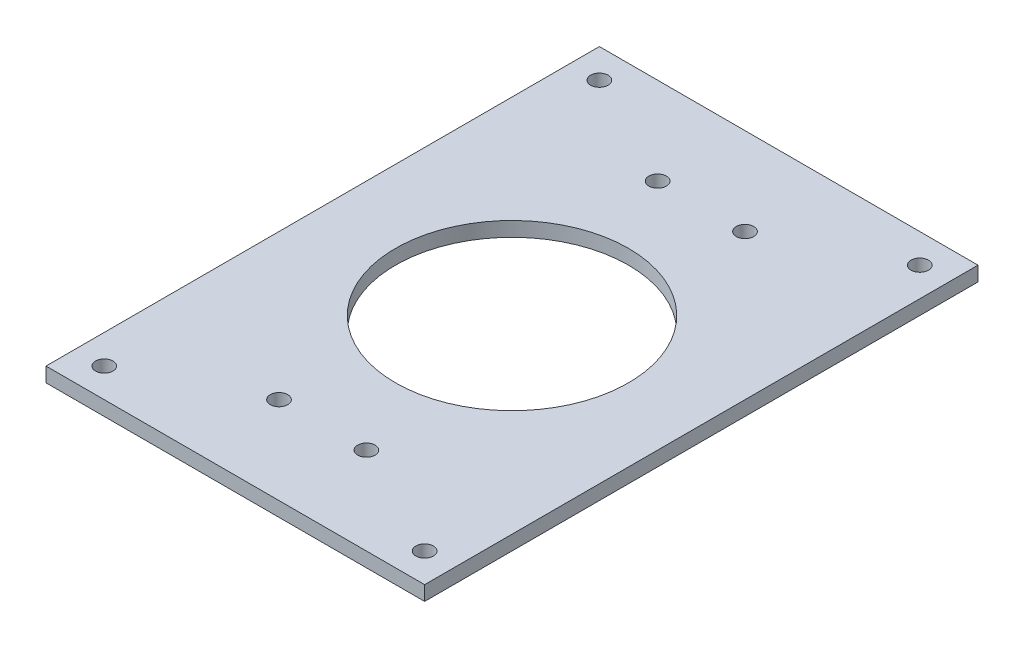
ISO-10303-21;
HEADER;
FILE_DESCRIPTION(('STEP AP214'),'2;1');
FILE_NAME('part.step','',(''),(''),'','','');
FILE_SCHEMA(('AUTOMOTIVE_DESIGN { 1 0 10303 214 1 1 1 1 }'));
ENDSEC;
DATA;
#1=APPLICATION_CONTEXT('core data for automotive mechanical design processes');
#2=APPLICATION_PROTOCOL_DEFINITION('international standard','automotive_design',2000,#1);
#3=PRODUCT_CONTEXT('',#1,'mechanical');
#4=PRODUCT('Part','Part','',(#3));
#5=PRODUCT_RELATED_PRODUCT_CATEGORY('part','',(#4));
#6=PRODUCT_DEFINITION_FORMATION('','',#4);
#7=PRODUCT_DEFINITION_CONTEXT('part definition',#1,'design');
#8=PRODUCT_DEFINITION('design','',#6,#7);
#9=PRODUCT_DEFINITION_SHAPE('','',#8);
#10=(LENGTH_UNIT() NAMED_UNIT(*) SI_UNIT(.MILLI.,.METRE.));
#11=(NAMED_UNIT(*) PLANE_ANGLE_UNIT() SI_UNIT($,.RADIAN.));
#12=(NAMED_UNIT(*) SI_UNIT($,.STERADIAN.) SOLID_ANGLE_UNIT());
#13=UNCERTAINTY_MEASURE_WITH_UNIT(LENGTH_MEASURE(1.E-05),#10,'distance_accuracy_value','');
#14=(GEOMETRIC_REPRESENTATION_CONTEXT(3) GLOBAL_UNCERTAINTY_ASSIGNED_CONTEXT((#13)) GLOBAL_UNIT_ASSIGNED_CONTEXT((#10,
#11,#12)) REPRESENTATION_CONTEXT('',''));
#15=CARTESIAN_POINT('',(0.,0.,0.));
#16=DIRECTION('',(0.,0.,1.));
#17=DIRECTION('',(1.,0.,0.));
#18=AXIS2_PLACEMENT_3D('',#15,#16,#17);
#19=CARTESIAN_POINT('',(32.5,2.5,47.5));
#20=DIRECTION('',(-1.,0.,0.));
#21=DIRECTION('',(0.,0.,1.));
#22=AXIS2_PLACEMENT_3D('',#19,#20,#21);
#23=PLANE('',#22);
#24=DIRECTION('',(0.,0.,-1.));
#25=VECTOR('',#24,1.);
#26=CARTESIAN_POINT('',(32.5,0.,47.5));
#27=LINE('',#26,#25);
#28=CARTESIAN_POINT('',(32.5,0.,47.5));
#29=VERTEX_POINT('',#28);
#30=CARTESIAN_POINT('',(32.5,0.,-47.5));
#31=VERTEX_POINT('',#30);
#32=EDGE_CURVE('E99',#29,#31,#27,.T.);
#33=ORIENTED_EDGE('',*,*,#32,.T.);
#34=DIRECTION('',(0.,-1.,0.));
#35=VECTOR('',#34,1.);
#36=CARTESIAN_POINT('',(32.5,2.5,-47.5));
#37=LINE('',#36,#35);
#38=CARTESIAN_POINT('',(32.5,2.5,-47.5));
#39=VERTEX_POINT('',#38);
#40=EDGE_CURVE('E11',#39,#31,#37,.T.);
#41=ORIENTED_EDGE('',*,*,#40,.F.);
#42=DIRECTION('',(0.,0.,-1.));
#43=VECTOR('',#42,1.);
#44=CARTESIAN_POINT('',(32.5,2.5,47.5));
#45=LINE('',#44,#43);
#46=CARTESIAN_POINT('',(32.5,2.5,47.5));
#47=VERTEX_POINT('',#46);
#48=EDGE_CURVE('E87',#47,#39,#45,.T.);
#49=ORIENTED_EDGE('',*,*,#48,.F.);
#50=DIRECTION('',(0.,-1.,0.));
#51=VECTOR('',#50,1.);
#52=CARTESIAN_POINT('',(32.5,2.5,47.5));
#53=LINE('',#52,#51);
#54=EDGE_CURVE('E95',#47,#29,#53,.T.);
#55=ORIENTED_EDGE('',*,*,#54,.T.);
#56=EDGE_LOOP('',(#33,#41,#49,#55));
#57=FACE_BOUND('',#56,.T.);
#58=ADVANCED_FACE('F36',(#57),#23,.F.);
#59=CARTESIAN_POINT('',(-32.5,2.5,-47.5));
#60=DIRECTION('',(0.,0.,1.));
#61=DIRECTION('',(1.,0.,0.));
#62=AXIS2_PLACEMENT_3D('',#59,#60,#61);
#63=PLANE('',#62);
#64=DIRECTION('',(-1.,0.,0.));
#65=VECTOR('',#64,1.);
#66=CARTESIAN_POINT('',(-32.5,0.,-47.5));
#67=LINE('',#66,#65);
#68=CARTESIAN_POINT('',(-32.5,0.,-47.5));
#69=VERTEX_POINT('',#68);
#70=EDGE_CURVE('E91',#31,#69,#67,.T.);
#71=ORIENTED_EDGE('',*,*,#70,.T.);
#72=DIRECTION('',(0.,-1.,0.));
#73=VECTOR('',#72,1.);
#74=CARTESIAN_POINT('',(-32.5,2.5,-47.5));
#75=LINE('',#74,#73);
#76=CARTESIAN_POINT('',(-32.5,2.5,-47.5));
#77=VERTEX_POINT('',#76);
#78=EDGE_CURVE('E44',#77,#69,#75,.T.);
#79=ORIENTED_EDGE('',*,*,#78,.F.);
#80=DIRECTION('',(-1.,0.,0.));
#81=VECTOR('',#80,1.);
#82=CARTESIAN_POINT('',(-32.5,2.5,-47.5));
#83=LINE('',#82,#81);
#84=EDGE_CURVE('E82',#39,#77,#83,.T.);
#85=ORIENTED_EDGE('',*,*,#84,.F.);
#86=ORIENTED_EDGE('',*,*,#40,.T.);
#87=EDGE_LOOP('',(#71,#79,#85,#86));
#88=FACE_BOUND('',#87,.T.);
#89=ADVANCED_FACE('F90',(#88),#63,.F.);
#90=CARTESIAN_POINT('',(-32.5,2.5,47.5));
#91=DIRECTION('',(1.,0.,0.));
#92=DIRECTION('',(0.,0.,-1.));
#93=AXIS2_PLACEMENT_3D('',#90,#91,#92);
#94=PLANE('',#93);
#95=DIRECTION('',(0.,0.,1.));
#96=VECTOR('',#95,1.);
#97=CARTESIAN_POINT('',(-32.5,0.,47.5));
#98=LINE('',#97,#96);
#99=CARTESIAN_POINT('',(-32.5,0.,47.5));
#100=VERTEX_POINT('',#99);
#101=EDGE_CURVE('E69',#69,#100,#98,.T.);
#102=ORIENTED_EDGE('',*,*,#101,.T.);
#103=DIRECTION('',(0.,-1.,0.));
#104=VECTOR('',#103,1.);
#105=CARTESIAN_POINT('',(-32.5,2.5,47.5));
#106=LINE('',#105,#104);
#107=CARTESIAN_POINT('',(-32.5,2.5,47.5));
#108=VERTEX_POINT('',#107);
#109=EDGE_CURVE('E92',#108,#100,#106,.T.);
#110=ORIENTED_EDGE('',*,*,#109,.F.);
#111=DIRECTION('',(0.,0.,1.));
#112=VECTOR('',#111,1.);
#113=CARTESIAN_POINT('',(-32.5,2.5,47.5));
#114=LINE('',#113,#112);
#115=EDGE_CURVE('E85',#77,#108,#114,.T.);
#116=ORIENTED_EDGE('',*,*,#115,.F.);
#117=ORIENTED_EDGE('',*,*,#78,.T.);
#118=EDGE_LOOP('',(#102,#110,#116,#117));
#119=FACE_BOUND('',#118,.T.);
#120=ADVANCED_FACE('F93',(#119),#94,.F.);
#121=CARTESIAN_POINT('',(-32.5,2.5,47.5));
#122=DIRECTION('',(0.,0.,-1.));
#123=DIRECTION('',(-1.,0.,0.));
#124=AXIS2_PLACEMENT_3D('',#121,#122,#123);
#125=PLANE('',#124);
#126=DIRECTION('',(1.,0.,0.));
#127=VECTOR('',#126,1.);
#128=CARTESIAN_POINT('',(-32.5,0.,47.5));
#129=LINE('',#128,#127);
#130=EDGE_CURVE('E75',#100,#29,#129,.T.);
#131=ORIENTED_EDGE('',*,*,#130,.T.);
#132=ORIENTED_EDGE('',*,*,#54,.F.);
#133=DIRECTION('',(1.,0.,0.));
#134=VECTOR('',#133,1.);
#135=CARTESIAN_POINT('',(-32.5,2.5,47.5));
#136=LINE('',#135,#134);
#137=EDGE_CURVE('E52',#108,#47,#136,.T.);
#138=ORIENTED_EDGE('',*,*,#137,.F.);
#139=ORIENTED_EDGE('',*,*,#109,.T.);
#140=EDGE_LOOP('',(#131,#132,#138,#139));
#141=FACE_BOUND('',#140,.T.);
#142=ADVANCED_FACE('F107',(#141),#125,.F.);
#143=CARTESIAN_POINT('',(0.,2.5,0.));
#144=DIRECTION('',(0.,-1.,0.));
#145=DIRECTION('',(0.,0.,-1.));
#146=AXIS2_PLACEMENT_3D('',#143,#144,#145);
#147=PLANE('',#146);
#148=CARTESIAN_POINT('',(0.,2.5,0.));
#149=DIRECTION('',(0.,1.,0.));
#150=DIRECTION('',(0.,0.,1.));
#151=AXIS2_PLACEMENT_3D('',#148,#149,#150);
#152=CIRCLE('',#151,20.);
#153=CARTESIAN_POINT('',(0.,2.5,20.));
#154=VERTEX_POINT('',#153);
#155=EDGE_CURVE('E161',#154,#154,#152,.T.);
#156=ORIENTED_EDGE('',*,*,#155,.F.);
#157=EDGE_LOOP('',(#156));
#158=FACE_BOUND('',#157,.T.);
#159=CARTESIAN_POINT('',(-27.5,2.5,-42.5));
#160=DIRECTION('',(0.,1.,0.));
#161=DIRECTION('',(0.,0.,-1.));
#162=AXIS2_PLACEMENT_3D('',#159,#160,#161);
#163=CIRCLE('',#162,1.5);
#164=CARTESIAN_POINT('',(-27.5,2.5,-44.));
#165=VERTEX_POINT('',#164);
#166=EDGE_CURVE('E131',#165,#165,#163,.T.);
#167=ORIENTED_EDGE('',*,*,#166,.F.);
#168=EDGE_LOOP('',(#167));
#169=FACE_BOUND('',#168,.T.);
#170=CARTESIAN_POINT('',(27.5,2.5,42.5));
#171=DIRECTION('',(0.,1.,0.));
#172=DIRECTION('',(0.,0.,-1.));
#173=AXIS2_PLACEMENT_3D('',#170,#171,#172);
#174=CIRCLE('',#173,1.5);
#175=CARTESIAN_POINT('',(27.5,2.5,41.));
#176=VERTEX_POINT('',#175);
#177=EDGE_CURVE('E138',#176,#176,#174,.T.);
#178=ORIENTED_EDGE('',*,*,#177,.F.);
#179=EDGE_LOOP('',(#178));
#180=FACE_BOUND('',#179,.T.);
#181=CARTESIAN_POINT('',(7.50000000000001,2.5,32.5));
#182=DIRECTION('',(0.,1.,0.));
#183=DIRECTION('',(0.,0.,-1.));
#184=AXIS2_PLACEMENT_3D('',#181,#182,#183);
#185=CIRCLE('',#184,1.5);
#186=CARTESIAN_POINT('',(7.50000000000001,2.5,31.));
#187=VERTEX_POINT('',#186);
#188=EDGE_CURVE('E119',#187,#187,#185,.T.);
#189=ORIENTED_EDGE('',*,*,#188,.F.);
#190=EDGE_LOOP('',(#189));
#191=FACE_BOUND('',#190,.T.);
#192=CARTESIAN_POINT('',(7.50000000000001,2.5,-32.5));
#193=DIRECTION('',(0.,1.,0.));
#194=DIRECTION('',(0.,0.,1.));
#195=AXIS2_PLACEMENT_3D('',#192,#193,#194);
#196=CIRCLE('',#195,1.5);
#197=CARTESIAN_POINT('',(7.50000000000001,2.5,-31.));
#198=VERTEX_POINT('',#197);
#199=EDGE_CURVE('E126',#198,#198,#196,.T.);
#200=ORIENTED_EDGE('',*,*,#199,.F.);
#201=EDGE_LOOP('',(#200));
#202=FACE_BOUND('',#201,.T.);
#203=CARTESIAN_POINT('',(-7.50000000000001,2.5,32.5));
#204=DIRECTION('',(0.,1.,0.));
#205=DIRECTION('',(0.,0.,1.));
#206=AXIS2_PLACEMENT_3D('',#203,#204,#205);
#207=CIRCLE('',#206,1.5);
#208=CARTESIAN_POINT('',(-7.50000000000001,2.5,34.));
#209=VERTEX_POINT('',#208);
#210=EDGE_CURVE('E155',#209,#209,#207,.T.);
#211=ORIENTED_EDGE('',*,*,#210,.F.);
#212=EDGE_LOOP('',(#211));
#213=FACE_BOUND('',#212,.T.);
#214=CARTESIAN_POINT('',(-27.5,2.5,42.5));
#215=DIRECTION('',(0.,1.,0.));
#216=DIRECTION('',(0.,0.,1.));
#217=AXIS2_PLACEMENT_3D('',#214,#215,#216);
#218=CIRCLE('',#217,1.5);
#219=CARTESIAN_POINT('',(-27.5,2.5,44.));
#220=VERTEX_POINT('',#219);
#221=EDGE_CURVE('E143',#220,#220,#218,.T.);
#222=ORIENTED_EDGE('',*,*,#221,.F.);
#223=EDGE_LOOP('',(#222));
#224=FACE_BOUND('',#223,.T.);
#225=CARTESIAN_POINT('',(-7.50000000000001,2.5,-32.5));
#226=DIRECTION('',(0.,1.,0.));
#227=DIRECTION('',(0.,0.,-1.));
#228=AXIS2_PLACEMENT_3D('',#225,#226,#227);
#229=CIRCLE('',#228,1.5);
#230=CARTESIAN_POINT('',(-7.50000000000001,2.5,-34.));
#231=VERTEX_POINT('',#230);
#232=EDGE_CURVE('E150',#231,#231,#229,.T.);
#233=ORIENTED_EDGE('',*,*,#232,.F.);
#234=EDGE_LOOP('',(#233));
#235=FACE_BOUND('',#234,.T.);
#236=CARTESIAN_POINT('',(27.5,2.5,-42.5));
#237=DIRECTION('',(0.,1.,0.));
#238=DIRECTION('',(0.,0.,1.));
#239=AXIS2_PLACEMENT_3D('',#236,#237,#238);
#240=CIRCLE('',#239,1.5);
#241=CARTESIAN_POINT('',(27.5,2.5,-41.));
#242=VERTEX_POINT('',#241);
#243=EDGE_CURVE('E113',#242,#242,#240,.T.);
#244=ORIENTED_EDGE('',*,*,#243,.F.);
#245=EDGE_LOOP('',(#244));
#246=FACE_BOUND('',#245,.T.);
#247=ORIENTED_EDGE('',*,*,#48,.T.);
#248=ORIENTED_EDGE('',*,*,#84,.T.);
#249=ORIENTED_EDGE('',*,*,#115,.T.);
#250=ORIENTED_EDGE('',*,*,#137,.T.);
#251=EDGE_LOOP('',(#247,#248,#249,#250));
#252=FACE_BOUND('',#251,.T.);
#253=ADVANCED_FACE('F83',(#158,#169,#180,#191,#202,#213,#224,#235,#246,#252),#147,.F.);
#254=CARTESIAN_POINT('',(0.,0.,0.));
#255=DIRECTION('',(0.,-1.,0.));
#256=DIRECTION('',(0.,0.,-1.));
#257=AXIS2_PLACEMENT_3D('',#254,#255,#256);
#258=PLANE('',#257);
#259=CARTESIAN_POINT('',(0.,0.,0.));
#260=DIRECTION('',(0.,1.,0.));
#261=DIRECTION('',(0.,0.,1.));
#262=AXIS2_PLACEMENT_3D('',#259,#260,#261);
#263=CIRCLE('',#262,20.);
#264=CARTESIAN_POINT('',(0.,0.,20.));
#265=VERTEX_POINT('',#264);
#266=EDGE_CURVE('E158',#265,#265,#263,.T.);
#267=ORIENTED_EDGE('',*,*,#266,.T.);
#268=EDGE_LOOP('',(#267));
#269=FACE_BOUND('',#268,.T.);
#270=CARTESIAN_POINT('',(-27.5,0.,-42.5));
#271=DIRECTION('',(0.,1.,0.));
#272=DIRECTION('',(0.,0.,-1.));
#273=AXIS2_PLACEMENT_3D('',#270,#271,#272);
#274=CIRCLE('',#273,1.5);
#275=CARTESIAN_POINT('',(-27.5,0.,-44.));
#276=VERTEX_POINT('',#275);
#277=EDGE_CURVE('E134',#276,#276,#274,.T.);
#278=ORIENTED_EDGE('',*,*,#277,.T.);
#279=EDGE_LOOP('',(#278));
#280=FACE_BOUND('',#279,.T.);
#281=CARTESIAN_POINT('',(27.5,0.,42.5));
#282=DIRECTION('',(0.,1.,0.));
#283=DIRECTION('',(0.,0.,-1.));
#284=AXIS2_PLACEMENT_3D('',#281,#282,#283);
#285=CIRCLE('',#284,1.5);
#286=CARTESIAN_POINT('',(27.5,0.,41.));
#287=VERTEX_POINT('',#286);
#288=EDGE_CURVE('E123',#287,#287,#285,.T.);
#289=ORIENTED_EDGE('',*,*,#288,.T.);
#290=EDGE_LOOP('',(#289));
#291=FACE_BOUND('',#290,.T.);
#292=CARTESIAN_POINT('',(7.50000000000001,0.,32.5));
#293=DIRECTION('',(0.,1.,0.));
#294=DIRECTION('',(0.,0.,-1.));
#295=AXIS2_PLACEMENT_3D('',#292,#293,#294);
#296=CIRCLE('',#295,1.5);
#297=CARTESIAN_POINT('',(7.50000000000001,0.,31.));
#298=VERTEX_POINT('',#297);
#299=EDGE_CURVE('E122',#298,#298,#296,.T.);
#300=ORIENTED_EDGE('',*,*,#299,.T.);
#301=EDGE_LOOP('',(#300));
#302=FACE_BOUND('',#301,.T.);
#303=CARTESIAN_POINT('',(7.50000000000001,0.,-32.5));
#304=DIRECTION('',(0.,1.,0.));
#305=DIRECTION('',(0.,0.,1.));
#306=AXIS2_PLACEMENT_3D('',#303,#304,#305);
#307=CIRCLE('',#306,1.5);
#308=CARTESIAN_POINT('',(7.50000000000001,0.,-31.));
#309=VERTEX_POINT('',#308);
#310=EDGE_CURVE('E116',#309,#309,#307,.T.);
#311=ORIENTED_EDGE('',*,*,#310,.T.);
#312=EDGE_LOOP('',(#311));
#313=FACE_BOUND('',#312,.T.);
#314=CARTESIAN_POINT('',(-7.50000000000001,0.,32.5));
#315=DIRECTION('',(0.,1.,0.));
#316=DIRECTION('',(0.,0.,1.));
#317=AXIS2_PLACEMENT_3D('',#314,#315,#316);
#318=CIRCLE('',#317,1.5);
#319=CARTESIAN_POINT('',(-7.50000000000001,0.,34.));
#320=VERTEX_POINT('',#319);
#321=EDGE_CURVE('E147',#320,#320,#318,.T.);
#322=ORIENTED_EDGE('',*,*,#321,.T.);
#323=EDGE_LOOP('',(#322));
#324=FACE_BOUND('',#323,.T.);
#325=CARTESIAN_POINT('',(-27.5,0.,42.5));
#326=DIRECTION('',(0.,1.,0.));
#327=DIRECTION('',(0.,0.,1.));
#328=AXIS2_PLACEMENT_3D('',#325,#326,#327);
#329=CIRCLE('',#328,1.5);
#330=CARTESIAN_POINT('',(-27.5,0.,44.));
#331=VERTEX_POINT('',#330);
#332=EDGE_CURVE('E146',#331,#331,#329,.T.);
#333=ORIENTED_EDGE('',*,*,#332,.T.);
#334=EDGE_LOOP('',(#333));
#335=FACE_BOUND('',#334,.T.);
#336=CARTESIAN_POINT('',(-7.50000000000001,0.,-32.5));
#337=DIRECTION('',(0.,1.,0.));
#338=DIRECTION('',(0.,0.,-1.));
#339=AXIS2_PLACEMENT_3D('',#336,#337,#338);
#340=CIRCLE('',#339,1.5);
#341=CARTESIAN_POINT('',(-7.50000000000001,0.,-34.));
#342=VERTEX_POINT('',#341);
#343=EDGE_CURVE('E135',#342,#342,#340,.T.);
#344=ORIENTED_EDGE('',*,*,#343,.T.);
#345=EDGE_LOOP('',(#344));
#346=FACE_BOUND('',#345,.T.);
#347=CARTESIAN_POINT('',(27.5,0.,-42.5));
#348=DIRECTION('',(0.,1.,0.));
#349=DIRECTION('',(0.,0.,1.));
#350=AXIS2_PLACEMENT_3D('',#347,#348,#349);
#351=CIRCLE('',#350,1.5);
#352=CARTESIAN_POINT('',(27.5,0.,-41.));
#353=VERTEX_POINT('',#352);
#354=EDGE_CURVE('E102',#353,#353,#351,.T.);
#355=ORIENTED_EDGE('',*,*,#354,.T.);
#356=EDGE_LOOP('',(#355));
#357=FACE_BOUND('',#356,.T.);
#358=ORIENTED_EDGE('',*,*,#32,.F.);
#359=ORIENTED_EDGE('',*,*,#130,.F.);
#360=ORIENTED_EDGE('',*,*,#101,.F.);
#361=ORIENTED_EDGE('',*,*,#70,.F.);
#362=EDGE_LOOP('',(#358,#359,#360,#361));
#363=FACE_BOUND('',#362,.T.);
#364=ADVANCED_FACE('F110',(#269,#280,#291,#302,#313,#324,#335,#346,#357,#363),#258,.T.);
#365=CARTESIAN_POINT('',(27.5,0.,-42.5));
#366=DIRECTION('',(0.,1.,0.));
#367=DIRECTION('',(0.,0.,1.));
#368=AXIS2_PLACEMENT_3D('',#365,#366,#367);
#369=CYLINDRICAL_SURFACE('',#368,1.5);
#370=ORIENTED_EDGE('',*,*,#354,.F.);
#371=EDGE_LOOP('',(#370));
#372=FACE_BOUND('',#371,.T.);
#373=ORIENTED_EDGE('',*,*,#243,.T.);
#374=EDGE_LOOP('',(#373));
#375=FACE_BOUND('',#374,.T.);
#376=ADVANCED_FACE('F195',(#372,#375),#369,.F.);
#377=CARTESIAN_POINT('',(-7.50000000000001,0.,-32.5));
#378=DIRECTION('',(0.,1.,0.));
#379=DIRECTION('',(0.,0.,1.));
#380=AXIS2_PLACEMENT_3D('',#377,#378,#379);
#381=CYLINDRICAL_SURFACE('',#380,1.5);
#382=ORIENTED_EDGE('',*,*,#343,.F.);
#383=EDGE_LOOP('',(#382));
#384=FACE_BOUND('',#383,.T.);
#385=ORIENTED_EDGE('',*,*,#232,.T.);
#386=EDGE_LOOP('',(#385));
#387=FACE_BOUND('',#386,.T.);
#388=ADVANCED_FACE('F197',(#384,#387),#381,.F.);
#389=CARTESIAN_POINT('',(-27.5,0.,42.5));
#390=DIRECTION('',(0.,1.,0.));
#391=DIRECTION('',(0.,0.,1.));
#392=AXIS2_PLACEMENT_3D('',#389,#390,#391);
#393=CYLINDRICAL_SURFACE('',#392,1.5);
#394=ORIENTED_EDGE('',*,*,#332,.F.);
#395=EDGE_LOOP('',(#394));
#396=FACE_BOUND('',#395,.T.);
#397=ORIENTED_EDGE('',*,*,#221,.T.);
#398=EDGE_LOOP('',(#397));
#399=FACE_BOUND('',#398,.T.);
#400=ADVANCED_FACE('F204',(#396,#399),#393,.F.);
#401=CARTESIAN_POINT('',(-7.50000000000001,0.,32.5));
#402=DIRECTION('',(0.,1.,0.));
#403=DIRECTION('',(0.,0.,1.));
#404=AXIS2_PLACEMENT_3D('',#401,#402,#403);
#405=CYLINDRICAL_SURFACE('',#404,1.5);
#406=ORIENTED_EDGE('',*,*,#321,.F.);
#407=EDGE_LOOP('',(#406));
#408=FACE_BOUND('',#407,.T.);
#409=ORIENTED_EDGE('',*,*,#210,.T.);
#410=EDGE_LOOP('',(#409));
#411=FACE_BOUND('',#410,.T.);
#412=ADVANCED_FACE('F270',(#408,#411),#405,.F.);
#413=CARTESIAN_POINT('',(7.50000000000001,0.,-32.5));
#414=DIRECTION('',(0.,1.,0.));
#415=DIRECTION('',(0.,0.,1.));
#416=AXIS2_PLACEMENT_3D('',#413,#414,#415);
#417=CYLINDRICAL_SURFACE('',#416,1.5);
#418=ORIENTED_EDGE('',*,*,#310,.F.);
#419=EDGE_LOOP('',(#418));
#420=FACE_BOUND('',#419,.T.);
#421=ORIENTED_EDGE('',*,*,#199,.T.);
#422=EDGE_LOOP('',(#421));
#423=FACE_BOUND('',#422,.T.);
#424=ADVANCED_FACE('F263',(#420,#423),#417,.F.);
#425=CARTESIAN_POINT('',(7.50000000000001,0.,32.5));
#426=DIRECTION('',(0.,1.,0.));
#427=DIRECTION('',(0.,0.,1.));
#428=AXIS2_PLACEMENT_3D('',#425,#426,#427);
#429=CYLINDRICAL_SURFACE('',#428,1.5);
#430=ORIENTED_EDGE('',*,*,#299,.F.);
#431=EDGE_LOOP('',(#430));
#432=FACE_BOUND('',#431,.T.);
#433=ORIENTED_EDGE('',*,*,#188,.T.);
#434=EDGE_LOOP('',(#433));
#435=FACE_BOUND('',#434,.T.);
#436=ADVANCED_FACE('F255',(#432,#435),#429,.F.);
#437=CARTESIAN_POINT('',(27.5,0.,42.5));
#438=DIRECTION('',(0.,1.,0.));
#439=DIRECTION('',(0.,0.,1.));
#440=AXIS2_PLACEMENT_3D('',#437,#438,#439);
#441=CYLINDRICAL_SURFACE('',#440,1.5);
#442=ORIENTED_EDGE('',*,*,#288,.F.);
#443=EDGE_LOOP('',(#442));
#444=FACE_BOUND('',#443,.T.);
#445=ORIENTED_EDGE('',*,*,#177,.T.);
#446=EDGE_LOOP('',(#445));
#447=FACE_BOUND('',#446,.T.);
#448=ADVANCED_FACE('F248',(#444,#447),#441,.F.);
#449=CARTESIAN_POINT('',(-27.5,0.,-42.5));
#450=DIRECTION('',(0.,1.,0.));
#451=DIRECTION('',(0.,0.,1.));
#452=AXIS2_PLACEMENT_3D('',#449,#450,#451);
#453=CYLINDRICAL_SURFACE('',#452,1.5);
#454=ORIENTED_EDGE('',*,*,#277,.F.);
#455=EDGE_LOOP('',(#454));
#456=FACE_BOUND('',#455,.T.);
#457=ORIENTED_EDGE('',*,*,#166,.T.);
#458=EDGE_LOOP('',(#457));
#459=FACE_BOUND('',#458,.T.);
#460=ADVANCED_FACE('F172',(#456,#459),#453,.F.);
#461=CARTESIAN_POINT('',(0.,0.,0.));
#462=DIRECTION('',(0.,1.,0.));
#463=DIRECTION('',(0.,0.,1.));
#464=AXIS2_PLACEMENT_3D('',#461,#462,#463);
#465=CYLINDRICAL_SURFACE('',#464,20.);
#466=ORIENTED_EDGE('',*,*,#266,.F.);
#467=EDGE_LOOP('',(#466));
#468=FACE_BOUND('',#467,.T.);
#469=ORIENTED_EDGE('',*,*,#155,.T.);
#470=EDGE_LOOP('',(#469));
#471=FACE_BOUND('',#470,.T.);
#472=ADVANCED_FACE('F169',(#468,#471),#465,.F.);
#473=CLOSED_SHELL('',(#58,#89,#120,#142,#253,#364,#376,#388,#400,#412,#424,#436,#448,#460,#472));
#474=MANIFOLD_SOLID_BREP('B2',#473);
#475=ADVANCED_BREP_SHAPE_REPRESENTATION('',(#18,#474),#14);
#476=SHAPE_DEFINITION_REPRESENTATION(#9,#475);
ENDSEC;
END-ISO-10303-21;
